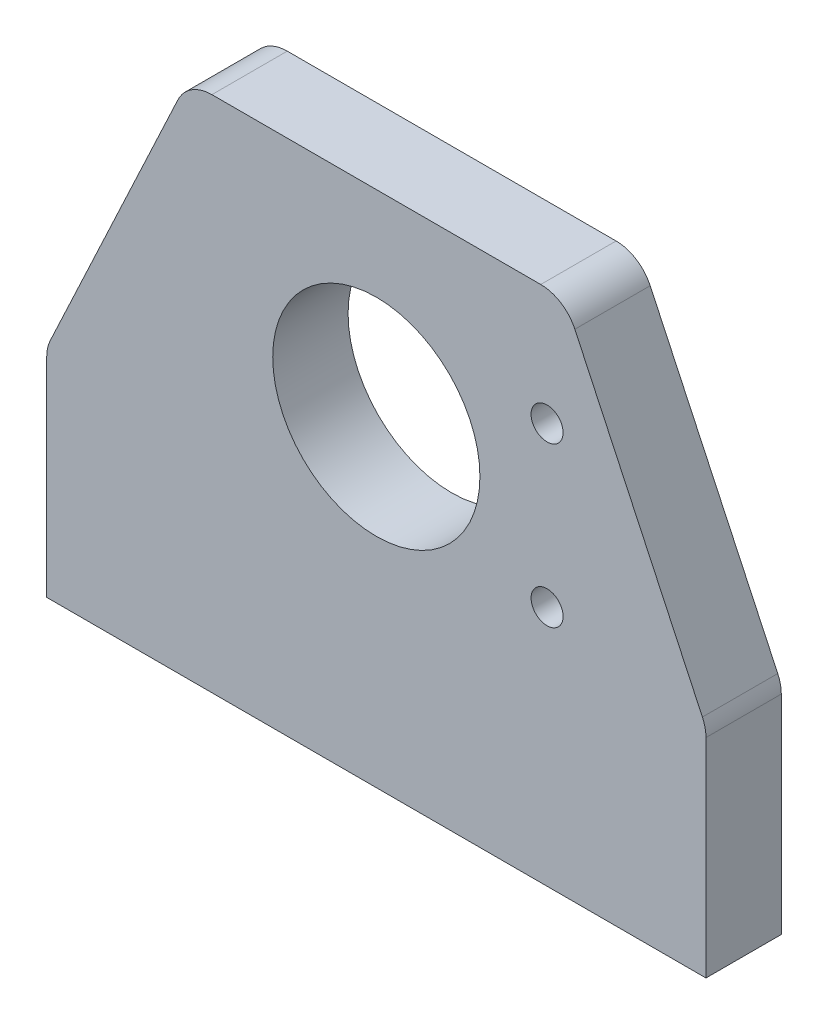
ISO-10303-21;
HEADER;
FILE_DESCRIPTION(('STEP AP214'),'2;1');
FILE_NAME('part.step','',(''),(''),'','','');
FILE_SCHEMA(('AUTOMOTIVE_DESIGN { 1 0 10303 214 1 1 1 1 }'));
ENDSEC;
DATA;
#1=APPLICATION_CONTEXT('core data for automotive mechanical design processes');
#2=APPLICATION_PROTOCOL_DEFINITION('international standard','automotive_design',2000,#1);
#3=PRODUCT_CONTEXT('',#1,'mechanical');
#4=PRODUCT('Part','Part','',(#3));
#5=PRODUCT_RELATED_PRODUCT_CATEGORY('part','',(#4));
#6=PRODUCT_DEFINITION_FORMATION('','',#4);
#7=PRODUCT_DEFINITION_CONTEXT('part definition',#1,'design');
#8=PRODUCT_DEFINITION('design','',#6,#7);
#9=PRODUCT_DEFINITION_SHAPE('','',#8);
#10=(LENGTH_UNIT() NAMED_UNIT(*) SI_UNIT(.MILLI.,.METRE.));
#11=(NAMED_UNIT(*) PLANE_ANGLE_UNIT() SI_UNIT($,.RADIAN.));
#12=(NAMED_UNIT(*) SI_UNIT($,.STERADIAN.) SOLID_ANGLE_UNIT());
#13=UNCERTAINTY_MEASURE_WITH_UNIT(LENGTH_MEASURE(1.E-05),#10,'distance_accuracy_value','');
#14=(GEOMETRIC_REPRESENTATION_CONTEXT(3) GLOBAL_UNCERTAINTY_ASSIGNED_CONTEXT((#13)) GLOBAL_UNIT_ASSIGNED_CONTEXT((#10,
#11,#12)) REPRESENTATION_CONTEXT('',''));
#15=CARTESIAN_POINT('',(0.,0.,0.));
#16=DIRECTION('',(0.,0.,1.));
#17=DIRECTION('',(1.,0.,0.));
#18=AXIS2_PLACEMENT_3D('',#15,#16,#17);
#19=CARTESIAN_POINT('',(83.0641796746334,113.210478315386,-23.));
#20=DIRECTION('',(-0.905458935958869,0.424433876230719,0.));
#21=DIRECTION('',(-0.424433876230719,-0.905458935958869,0.));
#22=AXIS2_PLACEMENT_3D('',#19,#20,#21);
#23=PLANE('',#22);
#24=DIRECTION('',(-0.424433876230719,-0.905458935958869,0.));
#25=VECTOR('',#24,1.);
#26=CARTESIAN_POINT('',(83.0641796746334,113.210478315386,-15.));
#27=LINE('',#26,#25);
#28=CARTESIAN_POINT('',(83.0641796746334,113.210478315386,-15.));
#29=VERTEX_POINT('',#28);
#30=CARTESIAN_POINT('',(69.5215304128654,84.3194932236143,-15.));
#31=VERTEX_POINT('',#30);
#32=EDGE_CURVE('E147',#29,#31,#27,.T.);
#33=ORIENTED_EDGE('',*,*,#32,.F.);
#34=DIRECTION('',(0.,0.,1.));
#35=VECTOR('',#34,1.);
#36=CARTESIAN_POINT('',(83.0641796746334,113.210478315386,-23.));
#37=LINE('',#36,#35);
#38=CARTESIAN_POINT('',(83.0641796746334,113.210478315386,-23.));
#39=VERTEX_POINT('',#38);
#40=EDGE_CURVE('E11',#39,#29,#37,.T.);
#41=ORIENTED_EDGE('',*,*,#40,.F.);
#42=DIRECTION('',(-0.424433876230719,-0.905458935958869,0.));
#43=VECTOR('',#42,1.);
#44=CARTESIAN_POINT('',(83.0641796746334,113.210478315386,-23.));
#45=LINE('',#44,#43);
#46=CARTESIAN_POINT('',(69.5215304128654,84.3194932236143,-23.));
#47=VERTEX_POINT('',#46);
#48=EDGE_CURVE('E171',#39,#47,#45,.T.);
#49=ORIENTED_EDGE('',*,*,#48,.T.);
#50=DIRECTION('',(0.,0.,1.));
#51=VECTOR('',#50,1.);
#52=CARTESIAN_POINT('',(69.5215304128654,84.3194932236143,-23.));
#53=LINE('',#52,#51);
#54=EDGE_CURVE('E45',#47,#31,#53,.T.);
#55=ORIENTED_EDGE('',*,*,#54,.T.);
#56=EDGE_LOOP('',(#33,#41,#49,#55));
#57=FACE_BOUND('',#56,.T.);
#58=ADVANCED_FACE('F39',(#57),#23,.T.);
#59=CARTESIAN_POINT('',(86.6860154184689,111.512742810463,-23.));
#60=DIRECTION('',(0.,0.,1.));
#61=DIRECTION('',(1.,0.,0.));
#62=AXIS2_PLACEMENT_3D('',#59,#60,#61);
#63=CYLINDRICAL_SURFACE('',#62,4.);
#64=CARTESIAN_POINT('',(86.6860154184689,111.512742810463,-15.));
#65=DIRECTION('',(0.,0.,1.));
#66=DIRECTION('',(1.,0.,0.));
#67=AXIS2_PLACEMENT_3D('',#64,#65,#66);
#68=CIRCLE('',#67,4.);
#69=CARTESIAN_POINT('',(86.6860154184689,115.512742810463,-15.));
#70=VERTEX_POINT('',#69);
#71=EDGE_CURVE('E173',#70,#29,#68,.T.);
#72=ORIENTED_EDGE('',*,*,#71,.F.);
#73=DIRECTION('',(0.,0.,1.));
#74=VECTOR('',#73,1.);
#75=CARTESIAN_POINT('',(86.6860154184689,115.512742810463,-23.));
#76=LINE('',#75,#74);
#77=CARTESIAN_POINT('',(86.6860154184689,115.512742810463,-23.));
#78=VERTEX_POINT('',#77);
#79=EDGE_CURVE('E48',#78,#70,#76,.T.);
#80=ORIENTED_EDGE('',*,*,#79,.F.);
#81=CARTESIAN_POINT('',(86.6860154184689,111.512742810463,-23.));
#82=DIRECTION('',(0.,0.,1.));
#83=DIRECTION('',(1.,0.,0.));
#84=AXIS2_PLACEMENT_3D('',#81,#82,#83);
#85=CIRCLE('',#84,4.);
#86=EDGE_CURVE('E141',#78,#39,#85,.T.);
#87=ORIENTED_EDGE('',*,*,#86,.T.);
#88=ORIENTED_EDGE('',*,*,#40,.T.);
#89=EDGE_LOOP('',(#72,#80,#87,#88));
#90=FACE_BOUND('',#89,.T.);
#91=ADVANCED_FACE('F192',(#90),#63,.T.);
#92=CARTESIAN_POINT('',(121.600716894933,115.512742810463,-23.));
#93=DIRECTION('',(0.,1.,0.));
#94=DIRECTION('',(0.,0.,1.));
#95=AXIS2_PLACEMENT_3D('',#92,#93,#94);
#96=PLANE('',#95);
#97=DIRECTION('',(-1.,0.,0.));
#98=VECTOR('',#97,1.);
#99=CARTESIAN_POINT('',(121.600716894933,115.512742810463,-15.));
#100=LINE('',#99,#98);
#101=CARTESIAN_POINT('',(121.600716894933,115.512742810463,-15.));
#102=VERTEX_POINT('',#101);
#103=EDGE_CURVE('E130',#102,#70,#100,.T.);
#104=ORIENTED_EDGE('',*,*,#103,.F.);
#105=DIRECTION('',(0.,0.,1.));
#106=VECTOR('',#105,1.);
#107=CARTESIAN_POINT('',(121.600716894933,115.512742810463,-23.));
#108=LINE('',#107,#106);
#109=CARTESIAN_POINT('',(121.600716894933,115.512742810463,-23.));
#110=VERTEX_POINT('',#109);
#111=EDGE_CURVE('E123',#110,#102,#108,.T.);
#112=ORIENTED_EDGE('',*,*,#111,.F.);
#113=DIRECTION('',(-1.,0.,0.));
#114=VECTOR('',#113,1.);
#115=CARTESIAN_POINT('',(121.600716894933,115.512742810463,-23.));
#116=LINE('',#115,#114);
#117=EDGE_CURVE('E124',#110,#78,#116,.T.);
#118=ORIENTED_EDGE('',*,*,#117,.T.);
#119=ORIENTED_EDGE('',*,*,#79,.T.);
#120=EDGE_LOOP('',(#104,#112,#118,#119));
#121=FACE_BOUND('',#120,.T.);
#122=ADVANCED_FACE('F121',(#121),#96,.T.);
#123=CARTESIAN_POINT('',(121.600716894933,111.512742810463,-23.));
#124=DIRECTION('',(0.,0.,1.));
#125=DIRECTION('',(1.,0.,0.));
#126=AXIS2_PLACEMENT_3D('',#123,#124,#125);
#127=CYLINDRICAL_SURFACE('',#126,4.);
#128=CARTESIAN_POINT('',(121.600716894933,111.512742810463,-15.));
#129=DIRECTION('',(0.,0.,-1.));
#130=DIRECTION('',(-1.,0.,0.));
#131=AXIS2_PLACEMENT_3D('',#128,#129,#130);
#132=CIRCLE('',#131,4.);
#133=CARTESIAN_POINT('',(125.222552638768,113.210478315386,-15.));
#134=VERTEX_POINT('',#133);
#135=EDGE_CURVE('E166',#102,#134,#132,.T.);
#136=ORIENTED_EDGE('',*,*,#135,.T.);
#137=DIRECTION('',(0.,0.,1.));
#138=VECTOR('',#137,1.);
#139=CARTESIAN_POINT('',(125.222552638768,113.210478315386,-23.));
#140=LINE('',#139,#138);
#141=CARTESIAN_POINT('',(125.222552638768,113.210478315386,-23.));
#142=VERTEX_POINT('',#141);
#143=EDGE_CURVE('E131',#142,#134,#140,.T.);
#144=ORIENTED_EDGE('',*,*,#143,.F.);
#145=CARTESIAN_POINT('',(121.600716894933,111.512742810463,-23.));
#146=DIRECTION('',(0.,0.,-1.));
#147=DIRECTION('',(-1.,0.,0.));
#148=AXIS2_PLACEMENT_3D('',#145,#146,#147);
#149=CIRCLE('',#148,4.);
#150=EDGE_CURVE('E132',#110,#142,#149,.T.);
#151=ORIENTED_EDGE('',*,*,#150,.F.);
#152=ORIENTED_EDGE('',*,*,#111,.T.);
#153=EDGE_LOOP('',(#136,#144,#151,#152));
#154=FACE_BOUND('',#153,.T.);
#155=ADVANCED_FACE('F134',(#154),#127,.T.);
#156=CARTESIAN_POINT('',(138.765201900536,84.3194932236143,-23.));
#157=DIRECTION('',(0.905458935958868,0.424433876230721,0.));
#158=DIRECTION('',(-0.424433876230721,0.905458935958868,0.));
#159=AXIS2_PLACEMENT_3D('',#156,#157,#158);
#160=PLANE('',#159);
#161=DIRECTION('',(-0.424433876230721,0.905458935958868,0.));
#162=VECTOR('',#161,1.);
#163=CARTESIAN_POINT('',(138.765201900536,84.3194932236143,-15.));
#164=LINE('',#163,#162);
#165=CARTESIAN_POINT('',(138.765201900536,84.3194932236143,-15.));
#166=VERTEX_POINT('',#165);
#167=EDGE_CURVE('E165',#166,#134,#164,.T.);
#168=ORIENTED_EDGE('',*,*,#167,.F.);
#169=DIRECTION('',(0.,0.,1.));
#170=VECTOR('',#169,1.);
#171=CARTESIAN_POINT('',(138.765201900536,84.3194932236143,-23.));
#172=LINE('',#171,#170);
#173=CARTESIAN_POINT('',(138.765201900536,84.3194932236143,-23.));
#174=VERTEX_POINT('',#173);
#175=EDGE_CURVE('E180',#174,#166,#172,.T.);
#176=ORIENTED_EDGE('',*,*,#175,.F.);
#177=DIRECTION('',(-0.424433876230721,0.905458935958868,0.));
#178=VECTOR('',#177,1.);
#179=CARTESIAN_POINT('',(138.765201900536,84.3194932236143,-23.));
#180=LINE('',#179,#178);
#181=EDGE_CURVE('E138',#174,#142,#180,.T.);
#182=ORIENTED_EDGE('',*,*,#181,.T.);
#183=ORIENTED_EDGE('',*,*,#143,.T.);
#184=EDGE_LOOP('',(#168,#176,#182,#183));
#185=FACE_BOUND('',#184,.T.);
#186=ADVANCED_FACE('F203',(#185),#160,.T.);
#187=CARTESIAN_POINT('',(135.143366156701,82.6217577186914,-23.));
#188=DIRECTION('',(0.,0.,1.));
#189=DIRECTION('',(1.,0.,0.));
#190=AXIS2_PLACEMENT_3D('',#187,#188,#189);
#191=CYLINDRICAL_SURFACE('',#190,4.00000000000001);
#192=CARTESIAN_POINT('',(135.143366156701,82.6217577186914,-15.));
#193=DIRECTION('',(0.,0.,-1.));
#194=DIRECTION('',(-1.,0.,0.));
#195=AXIS2_PLACEMENT_3D('',#192,#193,#194);
#196=CIRCLE('',#195,4.00000000000001);
#197=CARTESIAN_POINT('',(139.143366156701,82.6217577186914,-15.));
#198=VERTEX_POINT('',#197);
#199=EDGE_CURVE('E162',#166,#198,#196,.T.);
#200=ORIENTED_EDGE('',*,*,#199,.T.);
#201=DIRECTION('',(0.,0.,1.));
#202=VECTOR('',#201,1.);
#203=CARTESIAN_POINT('',(139.143366156701,82.6217577186914,-23.));
#204=LINE('',#203,#202);
#205=CARTESIAN_POINT('',(139.143366156701,82.6217577186914,-23.));
#206=VERTEX_POINT('',#205);
#207=EDGE_CURVE('E177',#206,#198,#204,.T.);
#208=ORIENTED_EDGE('',*,*,#207,.F.);
#209=CARTESIAN_POINT('',(135.143366156701,82.6217577186914,-23.));
#210=DIRECTION('',(0.,0.,-1.));
#211=DIRECTION('',(-1.,0.,0.));
#212=AXIS2_PLACEMENT_3D('',#209,#210,#211);
#213=CIRCLE('',#212,4.00000000000001);
#214=EDGE_CURVE('E307',#174,#206,#213,.T.);
#215=ORIENTED_EDGE('',*,*,#214,.F.);
#216=ORIENTED_EDGE('',*,*,#175,.T.);
#217=EDGE_LOOP('',(#200,#208,#215,#216));
#218=FACE_BOUND('',#217,.T.);
#219=ADVANCED_FACE('F209',(#218),#191,.T.);
#220=CARTESIAN_POINT('',(139.143366156701,60.5127428104633,-23.));
#221=DIRECTION('',(1.,0.,0.));
#222=DIRECTION('',(0.,0.,-1.));
#223=AXIS2_PLACEMENT_3D('',#220,#221,#222);
#224=PLANE('',#223);
#225=DIRECTION('',(0.,1.,0.));
#226=VECTOR('',#225,1.);
#227=CARTESIAN_POINT('',(139.143366156701,60.5127428104633,-15.));
#228=LINE('',#227,#226);
#229=CARTESIAN_POINT('',(139.143366156701,60.5127428104633,-15.));
#230=VERTEX_POINT('',#229);
#231=EDGE_CURVE('E159',#230,#198,#228,.T.);
#232=ORIENTED_EDGE('',*,*,#231,.F.);
#233=DIRECTION('',(0.,0.,1.));
#234=VECTOR('',#233,1.);
#235=CARTESIAN_POINT('',(139.143366156701,60.5127428104633,-23.));
#236=LINE('',#235,#234);
#237=CARTESIAN_POINT('',(139.143366156701,60.5127428104633,-23.));
#238=VERTEX_POINT('',#237);
#239=EDGE_CURVE('E181',#238,#230,#236,.T.);
#240=ORIENTED_EDGE('',*,*,#239,.F.);
#241=DIRECTION('',(0.,1.,0.));
#242=VECTOR('',#241,1.);
#243=CARTESIAN_POINT('',(139.143366156701,60.5127428104633,-23.));
#244=LINE('',#243,#242);
#245=EDGE_CURVE('E310',#238,#206,#244,.T.);
#246=ORIENTED_EDGE('',*,*,#245,.T.);
#247=ORIENTED_EDGE('',*,*,#207,.T.);
#248=EDGE_LOOP('',(#232,#240,#246,#247));
#249=FACE_BOUND('',#248,.T.);
#250=ADVANCED_FACE('F212',(#249),#224,.T.);
#251=CARTESIAN_POINT('',(69.1433661567009,60.5127428104633,-23.));
#252=DIRECTION('',(0.,-1.,0.));
#253=DIRECTION('',(0.,0.,-1.));
#254=AXIS2_PLACEMENT_3D('',#251,#252,#253);
#255=PLANE('',#254);
#256=CARTESIAN_POINT('',(76.1433661567009,60.5127428104633,-19.));
#257=DIRECTION('',(0.,-1.,0.));
#258=DIRECTION('',(0.,0.,-1.));
#259=AXIS2_PLACEMENT_3D('',#256,#257,#258);
#260=CIRCLE('',#259,2.79999999999999);
#261=CARTESIAN_POINT('',(76.1433661567009,60.5127428104633,-21.8));
#262=VERTEX_POINT('',#261);
#263=EDGE_CURVE('E275',#262,#262,#260,.T.);
#264=ORIENTED_EDGE('',*,*,#263,.F.);
#265=EDGE_LOOP('',(#264));
#266=FACE_BOUND('',#265,.T.);
#267=CARTESIAN_POINT('',(132.143366156701,60.5127428104633,-19.));
#268=DIRECTION('',(0.,-1.,0.));
#269=DIRECTION('',(0.,0.,-1.));
#270=AXIS2_PLACEMENT_3D('',#267,#268,#269);
#271=CIRCLE('',#270,2.80000000000001);
#272=CARTESIAN_POINT('',(132.143366156701,60.5127428104633,-21.8));
#273=VERTEX_POINT('',#272);
#274=EDGE_CURVE('E277',#273,#273,#271,.T.);
#275=ORIENTED_EDGE('',*,*,#274,.F.);
#276=EDGE_LOOP('',(#275));
#277=FACE_BOUND('',#276,.T.);
#278=DIRECTION('',(1.,0.,0.));
#279=VECTOR('',#278,1.);
#280=CARTESIAN_POINT('',(69.1433661567009,60.5127428104633,-15.));
#281=LINE('',#280,#279);
#282=CARTESIAN_POINT('',(69.1433661567009,60.5127428104633,-15.));
#283=VERTEX_POINT('',#282);
#284=EDGE_CURVE('E157',#283,#230,#281,.T.);
#285=ORIENTED_EDGE('',*,*,#284,.F.);
#286=DIRECTION('',(0.,0.,1.));
#287=VECTOR('',#286,1.);
#288=CARTESIAN_POINT('',(69.1433661567009,60.5127428104633,-23.));
#289=LINE('',#288,#287);
#290=CARTESIAN_POINT('',(69.1433661567009,60.5127428104633,-23.));
#291=VERTEX_POINT('',#290);
#292=EDGE_CURVE('E183',#291,#283,#289,.T.);
#293=ORIENTED_EDGE('',*,*,#292,.F.);
#294=DIRECTION('',(1.,0.,0.));
#295=VECTOR('',#294,1.);
#296=CARTESIAN_POINT('',(69.1433661567009,60.5127428104633,-23.));
#297=LINE('',#296,#295);
#298=EDGE_CURVE('E305',#291,#238,#297,.T.);
#299=ORIENTED_EDGE('',*,*,#298,.T.);
#300=ORIENTED_EDGE('',*,*,#239,.T.);
#301=EDGE_LOOP('',(#285,#293,#299,#300));
#302=FACE_BOUND('',#301,.T.);
#303=ADVANCED_FACE('F218',(#266,#277,#302),#255,.T.);
#304=CARTESIAN_POINT('',(69.1433661567009,82.6217577186914,-23.));
#305=DIRECTION('',(-1.,0.,0.));
#306=DIRECTION('',(0.,0.,1.));
#307=AXIS2_PLACEMENT_3D('',#304,#305,#306);
#308=PLANE('',#307);
#309=DIRECTION('',(0.,-1.,0.));
#310=VECTOR('',#309,1.);
#311=CARTESIAN_POINT('',(69.1433661567009,82.6217577186914,-15.));
#312=LINE('',#311,#310);
#313=CARTESIAN_POINT('',(69.1433661567009,82.6217577186914,-15.));
#314=VERTEX_POINT('',#313);
#315=EDGE_CURVE('E154',#314,#283,#312,.T.);
#316=ORIENTED_EDGE('',*,*,#315,.F.);
#317=DIRECTION('',(0.,0.,1.));
#318=VECTOR('',#317,1.);
#319=CARTESIAN_POINT('',(69.1433661567009,82.6217577186914,-23.));
#320=LINE('',#319,#318);
#321=CARTESIAN_POINT('',(69.1433661567009,82.6217577186914,-23.));
#322=VERTEX_POINT('',#321);
#323=EDGE_CURVE('E182',#322,#314,#320,.T.);
#324=ORIENTED_EDGE('',*,*,#323,.F.);
#325=DIRECTION('',(0.,-1.,0.));
#326=VECTOR('',#325,1.);
#327=CARTESIAN_POINT('',(69.1433661567009,82.6217577186914,-23.));
#328=LINE('',#327,#326);
#329=EDGE_CURVE('E303',#322,#291,#328,.T.);
#330=ORIENTED_EDGE('',*,*,#329,.T.);
#331=ORIENTED_EDGE('',*,*,#292,.T.);
#332=EDGE_LOOP('',(#316,#324,#330,#331));
#333=FACE_BOUND('',#332,.T.);
#334=ADVANCED_FACE('F217',(#333),#308,.T.);
#335=CARTESIAN_POINT('',(73.1433661567009,82.6217577186914,-23.));
#336=DIRECTION('',(0.,0.,1.));
#337=DIRECTION('',(1.,0.,0.));
#338=AXIS2_PLACEMENT_3D('',#335,#336,#337);
#339=CYLINDRICAL_SURFACE('',#338,4.);
#340=CARTESIAN_POINT('',(73.1433661567009,82.6217577186914,-15.));
#341=DIRECTION('',(0.,0.,-1.));
#342=DIRECTION('',(-1.,0.,0.));
#343=AXIS2_PLACEMENT_3D('',#340,#341,#342);
#344=CIRCLE('',#343,4.);
#345=EDGE_CURVE('E146',#314,#31,#344,.T.);
#346=ORIENTED_EDGE('',*,*,#345,.T.);
#347=ORIENTED_EDGE('',*,*,#54,.F.);
#348=CARTESIAN_POINT('',(73.1433661567009,82.6217577186914,-23.));
#349=DIRECTION('',(0.,0.,-1.));
#350=DIRECTION('',(-1.,0.,0.));
#351=AXIS2_PLACEMENT_3D('',#348,#349,#350);
#352=CIRCLE('',#351,4.);
#353=EDGE_CURVE('E102',#322,#47,#352,.T.);
#354=ORIENTED_EDGE('',*,*,#353,.F.);
#355=ORIENTED_EDGE('',*,*,#323,.T.);
#356=EDGE_LOOP('',(#346,#347,#354,#355));
#357=FACE_BOUND('',#356,.T.);
#358=ADVANCED_FACE('F190',(#357),#339,.T.);
#359=CARTESIAN_POINT('',(73.1433661567009,82.6217577186914,-23.));
#360=DIRECTION('',(0.,0.,-1.));
#361=DIRECTION('',(-1.,0.,0.));
#362=AXIS2_PLACEMENT_3D('',#359,#360,#361);
#363=PLANE('',#362);
#364=CARTESIAN_POINT('',(122.273366156701,103.071757718691,-23.));
#365=DIRECTION('',(0.,0.,-1.));
#366=DIRECTION('',(-1.,0.,0.));
#367=AXIS2_PLACEMENT_3D('',#364,#365,#366);
#368=CIRCLE('',#367,1.7);
#369=CARTESIAN_POINT('',(120.573366156701,103.071757718691,-23.));
#370=VERTEX_POINT('',#369);
#371=EDGE_CURVE('E290',#370,#370,#368,.T.);
#372=ORIENTED_EDGE('',*,*,#371,.F.);
#373=EDGE_LOOP('',(#372));
#374=FACE_BOUND('',#373,.T.);
#375=CARTESIAN_POINT('',(122.273366156701,86.1717577186914,-23.));
#376=DIRECTION('',(0.,0.,-1.));
#377=DIRECTION('',(-1.,0.,0.));
#378=AXIS2_PLACEMENT_3D('',#375,#376,#377);
#379=CIRCLE('',#378,1.7);
#380=CARTESIAN_POINT('',(120.573366156701,86.1717577186914,-23.));
#381=VERTEX_POINT('',#380);
#382=EDGE_CURVE('E274',#381,#381,#379,.T.);
#383=ORIENTED_EDGE('',*,*,#382,.F.);
#384=EDGE_LOOP('',(#383));
#385=FACE_BOUND('',#384,.T.);
#386=CARTESIAN_POINT('',(104.143366156701,94.6217577186914,-23.));
#387=DIRECTION('',(0.,0.,-1.));
#388=DIRECTION('',(-1.,0.,0.));
#389=AXIS2_PLACEMENT_3D('',#386,#387,#388);
#390=CIRCLE('',#389,11.);
#391=CARTESIAN_POINT('',(93.1433661567009,94.6217577186914,-23.));
#392=VERTEX_POINT('',#391);
#393=EDGE_CURVE('E288',#392,#392,#390,.T.);
#394=ORIENTED_EDGE('',*,*,#393,.F.);
#395=EDGE_LOOP('',(#394));
#396=FACE_BOUND('',#395,.T.);
#397=ORIENTED_EDGE('',*,*,#48,.F.);
#398=ORIENTED_EDGE('',*,*,#86,.F.);
#399=ORIENTED_EDGE('',*,*,#117,.F.);
#400=ORIENTED_EDGE('',*,*,#150,.T.);
#401=ORIENTED_EDGE('',*,*,#181,.F.);
#402=ORIENTED_EDGE('',*,*,#214,.T.);
#403=ORIENTED_EDGE('',*,*,#245,.F.);
#404=ORIENTED_EDGE('',*,*,#298,.F.);
#405=ORIENTED_EDGE('',*,*,#329,.F.);
#406=ORIENTED_EDGE('',*,*,#353,.T.);
#407=EDGE_LOOP('',(#397,#398,#399,#400,#401,#402,#403,#404,#405,#406));
#408=FACE_BOUND('',#407,.T.);
#409=ADVANCED_FACE('F139',(#374,#385,#396,#408),#363,.T.);
#410=CARTESIAN_POINT('',(73.1433661567009,82.6217577186914,-15.));
#411=DIRECTION('',(0.,0.,-1.));
#412=DIRECTION('',(-1.,0.,0.));
#413=AXIS2_PLACEMENT_3D('',#410,#411,#412);
#414=PLANE('',#413);
#415=CARTESIAN_POINT('',(122.273366156701,103.071757718691,-15.));
#416=DIRECTION('',(0.,0.,-1.));
#417=DIRECTION('',(-1.,0.,0.));
#418=AXIS2_PLACEMENT_3D('',#415,#416,#417);
#419=CIRCLE('',#418,1.7);
#420=CARTESIAN_POINT('',(120.573366156701,103.071757718691,-15.));
#421=VERTEX_POINT('',#420);
#422=EDGE_CURVE('E286',#421,#421,#419,.T.);
#423=ORIENTED_EDGE('',*,*,#422,.T.);
#424=EDGE_LOOP('',(#423));
#425=FACE_BOUND('',#424,.T.);
#426=CARTESIAN_POINT('',(122.273366156701,86.1717577186914,-15.));
#427=DIRECTION('',(0.,0.,-1.));
#428=DIRECTION('',(-1.,0.,0.));
#429=AXIS2_PLACEMENT_3D('',#426,#427,#428);
#430=CIRCLE('',#429,1.7);
#431=CARTESIAN_POINT('',(120.573366156701,86.1717577186914,-15.));
#432=VERTEX_POINT('',#431);
#433=EDGE_CURVE('E271',#432,#432,#430,.T.);
#434=ORIENTED_EDGE('',*,*,#433,.T.);
#435=EDGE_LOOP('',(#434));
#436=FACE_BOUND('',#435,.T.);
#437=CARTESIAN_POINT('',(104.143366156701,94.6217577186914,-15.));
#438=DIRECTION('',(0.,0.,-1.));
#439=DIRECTION('',(-1.,0.,0.));
#440=AXIS2_PLACEMENT_3D('',#437,#438,#439);
#441=CIRCLE('',#440,11.);
#442=CARTESIAN_POINT('',(93.1433661567009,94.6217577186914,-15.));
#443=VERTEX_POINT('',#442);
#444=EDGE_CURVE('E148',#443,#443,#441,.T.);
#445=ORIENTED_EDGE('',*,*,#444,.T.);
#446=EDGE_LOOP('',(#445));
#447=FACE_BOUND('',#446,.T.);
#448=ORIENTED_EDGE('',*,*,#32,.T.);
#449=ORIENTED_EDGE('',*,*,#345,.F.);
#450=ORIENTED_EDGE('',*,*,#315,.T.);
#451=ORIENTED_EDGE('',*,*,#284,.T.);
#452=ORIENTED_EDGE('',*,*,#231,.T.);
#453=ORIENTED_EDGE('',*,*,#199,.F.);
#454=ORIENTED_EDGE('',*,*,#167,.T.);
#455=ORIENTED_EDGE('',*,*,#135,.F.);
#456=ORIENTED_EDGE('',*,*,#103,.T.);
#457=ORIENTED_EDGE('',*,*,#71,.T.);
#458=EDGE_LOOP('',(#448,#449,#450,#451,#452,#453,#454,#455,#456,#457));
#459=FACE_BOUND('',#458,.T.);
#460=ADVANCED_FACE('F189',(#425,#436,#447,#459),#414,.F.);
#461=CARTESIAN_POINT('',(104.143366156701,94.6217577186914,-15.));
#462=DIRECTION('',(0.,0.,-1.));
#463=DIRECTION('',(-1.,0.,0.));
#464=AXIS2_PLACEMENT_3D('',#461,#462,#463);
#465=CYLINDRICAL_SURFACE('',#464,11.);
#466=ORIENTED_EDGE('',*,*,#444,.F.);
#467=EDGE_LOOP('',(#466));
#468=FACE_BOUND('',#467,.T.);
#469=ORIENTED_EDGE('',*,*,#393,.T.);
#470=EDGE_LOOP('',(#469));
#471=FACE_BOUND('',#470,.T.);
#472=ADVANCED_FACE('F233',(#468,#471),#465,.F.);
#473=CARTESIAN_POINT('',(122.273366156701,86.1717577186914,-15.));
#474=DIRECTION('',(0.,0.,-1.));
#475=DIRECTION('',(-1.,0.,0.));
#476=AXIS2_PLACEMENT_3D('',#473,#474,#475);
#477=CYLINDRICAL_SURFACE('',#476,1.7);
#478=ORIENTED_EDGE('',*,*,#433,.F.);
#479=EDGE_LOOP('',(#478));
#480=FACE_BOUND('',#479,.T.);
#481=ORIENTED_EDGE('',*,*,#382,.T.);
#482=EDGE_LOOP('',(#481));
#483=FACE_BOUND('',#482,.T.);
#484=ADVANCED_FACE('F241',(#480,#483),#477,.F.);
#485=CARTESIAN_POINT('',(122.273366156701,103.071757718691,-15.));
#486=DIRECTION('',(0.,0.,-1.));
#487=DIRECTION('',(-1.,0.,0.));
#488=AXIS2_PLACEMENT_3D('',#485,#486,#487);
#489=CYLINDRICAL_SURFACE('',#488,1.7);
#490=ORIENTED_EDGE('',*,*,#422,.F.);
#491=EDGE_LOOP('',(#490));
#492=FACE_BOUND('',#491,.T.);
#493=ORIENTED_EDGE('',*,*,#371,.T.);
#494=EDGE_LOOP('',(#493));
#495=FACE_BOUND('',#494,.T.);
#496=ADVANCED_FACE('F245',(#492,#495),#489,.F.);
#497=CARTESIAN_POINT('',(132.143366156701,70.5127428104633,-19.));
#498=DIRECTION('',(0.,-1.,0.));
#499=DIRECTION('',(0.,0.,-1.));
#500=AXIS2_PLACEMENT_3D('',#497,#498,#499);
#501=CYLINDRICAL_SURFACE('',#500,2.80000000000001);
#502=CARTESIAN_POINT('',(132.143366156701,70.5127428104633,-19.));
#503=DIRECTION('',(0.,-1.,0.));
#504=DIRECTION('',(0.,0.,-1.));
#505=AXIS2_PLACEMENT_3D('',#502,#503,#504);
#506=CIRCLE('',#505,2.80000000000001);
#507=CARTESIAN_POINT('',(132.143366156701,70.5127428104633,-21.8));
#508=VERTEX_POINT('',#507);
#509=EDGE_CURVE('E284',#508,#508,#506,.T.);
#510=ORIENTED_EDGE('',*,*,#509,.F.);
#511=EDGE_LOOP('',(#510));
#512=FACE_BOUND('',#511,.T.);
#513=ORIENTED_EDGE('',*,*,#274,.T.);
#514=EDGE_LOOP('',(#513));
#515=FACE_BOUND('',#514,.T.);
#516=ADVANCED_FACE('F249',(#512,#515),#501,.F.);
#517=CARTESIAN_POINT('',(132.143366156701,70.5127428104633,-19.));
#518=DIRECTION('',(0.,-1.,0.));
#519=DIRECTION('',(0.,0.,-1.));
#520=AXIS2_PLACEMENT_3D('',#517,#518,#519);
#521=PLANE('',#520);
#522=ORIENTED_EDGE('',*,*,#509,.T.);
#523=EDGE_LOOP('',(#522));
#524=FACE_BOUND('',#523,.T.);
#525=ADVANCED_FACE('F251',(#524),#521,.T.);
#526=CARTESIAN_POINT('',(76.1433661567009,70.5127428104633,-19.));
#527=DIRECTION('',(0.,-1.,0.));
#528=DIRECTION('',(0.,0.,-1.));
#529=AXIS2_PLACEMENT_3D('',#526,#527,#528);
#530=CYLINDRICAL_SURFACE('',#529,2.79999999999999);
#531=CARTESIAN_POINT('',(76.1433661567009,70.5127428104633,-19.));
#532=DIRECTION('',(0.,-1.,0.));
#533=DIRECTION('',(0.,0.,-1.));
#534=AXIS2_PLACEMENT_3D('',#531,#532,#533);
#535=CIRCLE('',#534,2.79999999999999);
#536=CARTESIAN_POINT('',(76.1433661567009,70.5127428104633,-21.8));
#537=VERTEX_POINT('',#536);
#538=EDGE_CURVE('E269',#537,#537,#535,.T.);
#539=ORIENTED_EDGE('',*,*,#538,.F.);
#540=EDGE_LOOP('',(#539));
#541=FACE_BOUND('',#540,.T.);
#542=ORIENTED_EDGE('',*,*,#263,.T.);
#543=EDGE_LOOP('',(#542));
#544=FACE_BOUND('',#543,.T.);
#545=ADVANCED_FACE('F253',(#541,#544),#530,.F.);
#546=CARTESIAN_POINT('',(76.1433661567009,70.5127428104633,-19.));
#547=DIRECTION('',(0.,-1.,0.));
#548=DIRECTION('',(0.,0.,-1.));
#549=AXIS2_PLACEMENT_3D('',#546,#547,#548);
#550=PLANE('',#549);
#551=ORIENTED_EDGE('',*,*,#538,.T.);
#552=EDGE_LOOP('',(#551));
#553=FACE_BOUND('',#552,.T.);
#554=ADVANCED_FACE('F263',(#553),#550,.T.);
#555=CLOSED_SHELL('',(#58,#91,#122,#155,#186,#219,#250,#303,#334,#358,#409,#460,#472,#484,#496,
#516,#525,#545,#554));
#556=MANIFOLD_SOLID_BREP('B2',#555);
#557=ADVANCED_BREP_SHAPE_REPRESENTATION('',(#18,#556),#14);
#558=SHAPE_DEFINITION_REPRESENTATION(#9,#557);
ENDSEC;
END-ISO-10303-21;
